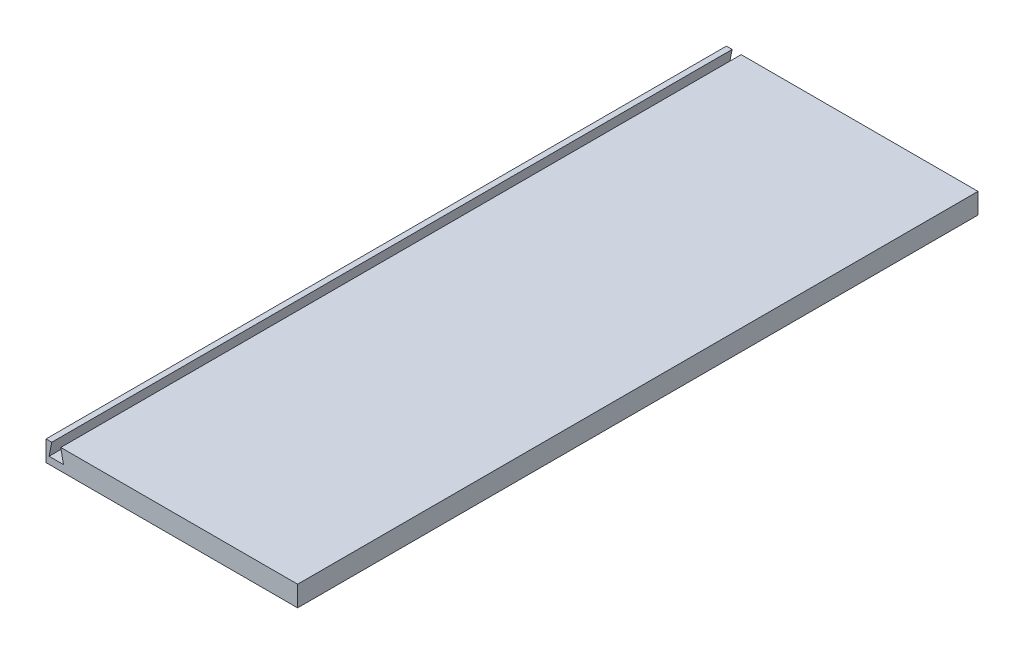
ISO-10303-21;
HEADER;
FILE_DESCRIPTION(('STEP AP214'),'2;1');
FILE_NAME('part.step','',(''),(''),'','','');
FILE_SCHEMA(('AUTOMOTIVE_DESIGN { 1 0 10303 214 1 1 1 1 }'));
ENDSEC;
DATA;
#1=APPLICATION_CONTEXT('core data for automotive mechanical design processes');
#2=APPLICATION_PROTOCOL_DEFINITION('international standard','automotive_design',2000,#1);
#3=PRODUCT_CONTEXT('',#1,'mechanical');
#4=PRODUCT('Part','Part','',(#3));
#5=PRODUCT_RELATED_PRODUCT_CATEGORY('part','',(#4));
#6=PRODUCT_DEFINITION_FORMATION('','',#4);
#7=PRODUCT_DEFINITION_CONTEXT('part definition',#1,'design');
#8=PRODUCT_DEFINITION('design','',#6,#7);
#9=PRODUCT_DEFINITION_SHAPE('','',#8);
#10=(LENGTH_UNIT() NAMED_UNIT(*) SI_UNIT(.MILLI.,.METRE.));
#11=(NAMED_UNIT(*) PLANE_ANGLE_UNIT() SI_UNIT($,.RADIAN.));
#12=(NAMED_UNIT(*) SI_UNIT($,.STERADIAN.) SOLID_ANGLE_UNIT());
#13=UNCERTAINTY_MEASURE_WITH_UNIT(LENGTH_MEASURE(1.E-05),#10,'distance_accuracy_value','');
#14=(GEOMETRIC_REPRESENTATION_CONTEXT(3) GLOBAL_UNCERTAINTY_ASSIGNED_CONTEXT((#13)) GLOBAL_UNIT_ASSIGNED_CONTEXT((#10,
#11,#12)) REPRESENTATION_CONTEXT('',''));
#15=CARTESIAN_POINT('',(0.,0.,0.));
#16=DIRECTION('',(0.,0.,1.));
#17=DIRECTION('',(1.,0.,0.));
#18=AXIS2_PLACEMENT_3D('',#15,#16,#17);
#19=CARTESIAN_POINT('',(0.,8.,-265.));
#20=DIRECTION('',(0.,1.,0.));
#21=DIRECTION('',(0.,0.,1.));
#22=AXIS2_PLACEMENT_3D('',#19,#20,#21);
#23=PLANE('',#22);
#24=DIRECTION('',(0.,0.,1.));
#25=VECTOR('',#24,1.);
#26=CARTESIAN_POINT('',(5.75495097567964,8.,-265.));
#27=LINE('',#26,#25);
#28=CARTESIAN_POINT('',(5.75495097567964,8.,-265.));
#29=VERTEX_POINT('',#28);
#30=CARTESIAN_POINT('',(5.75495097567964,8.,0.));
#31=VERTEX_POINT('',#30);
#32=EDGE_CURVE('E135',#29,#31,#27,.T.);
#33=ORIENTED_EDGE('',*,*,#32,.T.);
#34=DIRECTION('',(-1.,0.,0.));
#35=VECTOR('',#34,1.);
#36=CARTESIAN_POINT('',(0.,8.,0.));
#37=LINE('',#36,#35);
#38=CARTESIAN_POINT('',(98.,8.,0.));
#39=VERTEX_POINT('',#38);
#40=EDGE_CURVE('E141',#39,#31,#37,.T.);
#41=ORIENTED_EDGE('',*,*,#40,.F.);
#42=DIRECTION('',(0.,0.,1.));
#43=VECTOR('',#42,1.);
#44=CARTESIAN_POINT('',(98.,8.,-265.));
#45=LINE('',#44,#43);
#46=CARTESIAN_POINT('',(98.,8.,-265.));
#47=VERTEX_POINT('',#46);
#48=EDGE_CURVE('E41',#47,#39,#45,.T.);
#49=ORIENTED_EDGE('',*,*,#48,.F.);
#50=DIRECTION('',(-1.,0.,0.));
#51=VECTOR('',#50,1.);
#52=CARTESIAN_POINT('',(0.,8.,-265.));
#53=LINE('',#52,#51);
#54=EDGE_CURVE('E123',#47,#29,#53,.T.);
#55=ORIENTED_EDGE('',*,*,#54,.T.);
#56=EDGE_LOOP('',(#33,#41,#49,#55));
#57=FACE_BOUND('',#56,.T.);
#58=ADVANCED_FACE('F32',(#57),#23,.T.);
#59=CARTESIAN_POINT('',(0.,0.,-265.));
#60=DIRECTION('',(-1.,0.,0.));
#61=DIRECTION('',(0.,0.,1.));
#62=AXIS2_PLACEMENT_3D('',#59,#60,#61);
#63=PLANE('',#62);
#64=DIRECTION('',(0.,-1.,0.));
#65=VECTOR('',#64,1.);
#66=CARTESIAN_POINT('',(0.,0.,0.));
#67=LINE('',#66,#65);
#68=CARTESIAN_POINT('',(0.,8.,0.));
#69=VERTEX_POINT('',#68);
#70=CARTESIAN_POINT('',(0.,0.,0.));
#71=VERTEX_POINT('',#70);
#72=EDGE_CURVE('E132',#69,#71,#67,.T.);
#73=ORIENTED_EDGE('',*,*,#72,.F.);
#74=DIRECTION('',(0.,0.,1.));
#75=VECTOR('',#74,1.);
#76=CARTESIAN_POINT('',(0.,8.,-265.));
#77=LINE('',#76,#75);
#78=CARTESIAN_POINT('',(0.,8.,-265.));
#79=VERTEX_POINT('',#78);
#80=EDGE_CURVE('E11',#79,#69,#77,.T.);
#81=ORIENTED_EDGE('',*,*,#80,.F.);
#82=DIRECTION('',(0.,-1.,0.));
#83=VECTOR('',#82,1.);
#84=CARTESIAN_POINT('',(0.,0.,-265.));
#85=LINE('',#84,#83);
#86=CARTESIAN_POINT('',(0.,0.,-265.));
#87=VERTEX_POINT('',#86);
#88=EDGE_CURVE('E122',#79,#87,#85,.T.);
#89=ORIENTED_EDGE('',*,*,#88,.T.);
#90=DIRECTION('',(0.,0.,1.));
#91=VECTOR('',#90,1.);
#92=CARTESIAN_POINT('',(0.,0.,-265.));
#93=LINE('',#92,#91);
#94=EDGE_CURVE('E36',#87,#71,#93,.T.);
#95=ORIENTED_EDGE('',*,*,#94,.T.);
#96=EDGE_LOOP('',(#73,#81,#89,#95));
#97=FACE_BOUND('',#96,.T.);
#98=ADVANCED_FACE('F34',(#97),#63,.T.);
#99=DIRECTION('',(0.,0.,1.));
#100=VECTOR('',#99,1.);
#101=CARTESIAN_POINT('',(2.24504902432036,8.,-265.));
#102=LINE('',#101,#100);
#103=CARTESIAN_POINT('',(2.24504902432036,8.,-265.));
#104=VERTEX_POINT('',#103);
#105=CARTESIAN_POINT('',(2.24504902432036,8.,0.));
#106=VERTEX_POINT('',#105);
#107=EDGE_CURVE('E49',#104,#106,#102,.T.);
#108=ORIENTED_EDGE('',*,*,#107,.F.);
#109=EDGE_CURVE('E56',#104,#79,#53,.T.);
#110=ORIENTED_EDGE('',*,*,#109,.T.);
#111=ORIENTED_EDGE('',*,*,#80,.T.);
#112=EDGE_CURVE('E78',#106,#69,#37,.T.);
#113=ORIENTED_EDGE('',*,*,#112,.F.);
#114=EDGE_LOOP('',(#108,#110,#111,#113));
#115=FACE_BOUND('',#114,.T.);
#116=ADVANCED_FACE('F115',(#115),#23,.T.);
#117=CARTESIAN_POINT('',(98.,0.,-265.));
#118=DIRECTION('',(1.,0.,0.));
#119=DIRECTION('',(0.,0.,-1.));
#120=AXIS2_PLACEMENT_3D('',#117,#118,#119);
#121=PLANE('',#120);
#122=DIRECTION('',(0.,1.,0.));
#123=VECTOR('',#122,1.);
#124=CARTESIAN_POINT('',(98.,0.,0.));
#125=LINE('',#124,#123);
#126=CARTESIAN_POINT('',(98.,0.,0.));
#127=VERTEX_POINT('',#126);
#128=EDGE_CURVE('E138',#127,#39,#125,.T.);
#129=ORIENTED_EDGE('',*,*,#128,.F.);
#130=DIRECTION('',(0.,0.,1.));
#131=VECTOR('',#130,1.);
#132=CARTESIAN_POINT('',(98.,0.,-265.));
#133=LINE('',#132,#131);
#134=CARTESIAN_POINT('',(98.,0.,-265.));
#135=VERTEX_POINT('',#134);
#136=EDGE_CURVE('E144',#135,#127,#133,.T.);
#137=ORIENTED_EDGE('',*,*,#136,.F.);
#138=DIRECTION('',(0.,1.,0.));
#139=VECTOR('',#138,1.);
#140=CARTESIAN_POINT('',(98.,0.,-265.));
#141=LINE('',#140,#139);
#142=EDGE_CURVE('E124',#135,#47,#141,.T.);
#143=ORIENTED_EDGE('',*,*,#142,.T.);
#144=ORIENTED_EDGE('',*,*,#48,.T.);
#145=EDGE_LOOP('',(#129,#137,#143,#144));
#146=FACE_BOUND('',#145,.T.);
#147=ADVANCED_FACE('F172',(#146),#121,.T.);
#148=CARTESIAN_POINT('',(0.,0.,-265.));
#149=DIRECTION('',(0.,-1.,0.));
#150=DIRECTION('',(0.,0.,-1.));
#151=AXIS2_PLACEMENT_3D('',#148,#149,#150);
#152=PLANE('',#151);
#153=DIRECTION('',(1.,0.,0.));
#154=VECTOR('',#153,1.);
#155=CARTESIAN_POINT('',(0.,0.,0.));
#156=LINE('',#155,#154);
#157=EDGE_CURVE('E134',#71,#127,#156,.T.);
#158=ORIENTED_EDGE('',*,*,#157,.F.);
#159=ORIENTED_EDGE('',*,*,#94,.F.);
#160=DIRECTION('',(1.,0.,0.));
#161=VECTOR('',#160,1.);
#162=CARTESIAN_POINT('',(0.,0.,-265.));
#163=LINE('',#162,#161);
#164=EDGE_CURVE('E128',#87,#135,#163,.T.);
#165=ORIENTED_EDGE('',*,*,#164,.T.);
#166=ORIENTED_EDGE('',*,*,#136,.T.);
#167=EDGE_LOOP('',(#158,#159,#165,#166));
#168=FACE_BOUND('',#167,.T.);
#169=ADVANCED_FACE('F148',(#168),#152,.T.);
#170=CARTESIAN_POINT('',(0.,0.,-265.));
#171=DIRECTION('',(0.,0.,-1.));
#172=DIRECTION('',(-1.,0.,0.));
#173=AXIS2_PLACEMENT_3D('',#170,#171,#172);
#174=PLANE('',#173);
#175=DIRECTION('',(-0.196116135138184,0.98058067569092,0.));
#176=VECTOR('',#175,1.);
#177=CARTESIAN_POINT('',(6.80495097567964,2.75,-265.));
#178=LINE('',#177,#176);
#179=CARTESIAN_POINT('',(6.80495097567964,2.75,-265.));
#180=VERTEX_POINT('',#179);
#181=EDGE_CURVE('E116',#180,#29,#178,.T.);
#182=ORIENTED_EDGE('',*,*,#181,.T.);
#183=ORIENTED_EDGE('',*,*,#54,.F.);
#184=ORIENTED_EDGE('',*,*,#142,.F.);
#185=ORIENTED_EDGE('',*,*,#164,.F.);
#186=ORIENTED_EDGE('',*,*,#88,.F.);
#187=ORIENTED_EDGE('',*,*,#109,.F.);
#188=DIRECTION('',(-0.196116135138184,-0.98058067569092,0.));
#189=VECTOR('',#188,1.);
#190=CARTESIAN_POINT('',(2.24504902432036,8.,-265.));
#191=LINE('',#190,#189);
#192=CARTESIAN_POINT('',(1.19504902432036,2.75,-265.));
#193=VERTEX_POINT('',#192);
#194=EDGE_CURVE('E106',#104,#193,#191,.T.);
#195=ORIENTED_EDGE('',*,*,#194,.T.);
#196=DIRECTION('',(1.,0.,0.));
#197=VECTOR('',#196,1.);
#198=CARTESIAN_POINT('',(1.19504902432036,2.75,-265.));
#199=LINE('',#198,#197);
#200=EDGE_CURVE('E112',#193,#180,#199,.T.);
#201=ORIENTED_EDGE('',*,*,#200,.T.);
#202=EDGE_LOOP('',(#182,#183,#184,#185,#186,#187,#195,#201));
#203=FACE_BOUND('',#202,.T.);
#204=ADVANCED_FACE('F120',(#203),#174,.T.);
#205=CARTESIAN_POINT('',(0.,0.,0.));
#206=DIRECTION('',(0.,0.,-1.));
#207=DIRECTION('',(-1.,0.,0.));
#208=AXIS2_PLACEMENT_3D('',#205,#206,#207);
#209=PLANE('',#208);
#210=ORIENTED_EDGE('',*,*,#40,.T.);
#211=DIRECTION('',(-0.196116135138184,0.98058067569092,0.));
#212=VECTOR('',#211,1.);
#213=CARTESIAN_POINT('',(6.80495097567964,2.75,0.));
#214=LINE('',#213,#212);
#215=CARTESIAN_POINT('',(6.80495097567964,2.75,0.));
#216=VERTEX_POINT('',#215);
#217=EDGE_CURVE('E113',#216,#31,#214,.T.);
#218=ORIENTED_EDGE('',*,*,#217,.F.);
#219=DIRECTION('',(1.,0.,0.));
#220=VECTOR('',#219,1.);
#221=CARTESIAN_POINT('',(1.19504902432036,2.75,0.));
#222=LINE('',#221,#220);
#223=CARTESIAN_POINT('',(1.19504902432036,2.75,0.));
#224=VERTEX_POINT('',#223);
#225=EDGE_CURVE('E194',#224,#216,#222,.T.);
#226=ORIENTED_EDGE('',*,*,#225,.F.);
#227=DIRECTION('',(-0.196116135138184,-0.98058067569092,0.));
#228=VECTOR('',#227,1.);
#229=CARTESIAN_POINT('',(2.24504902432036,8.,0.));
#230=LINE('',#229,#228);
#231=EDGE_CURVE('E193',#106,#224,#230,.T.);
#232=ORIENTED_EDGE('',*,*,#231,.F.);
#233=ORIENTED_EDGE('',*,*,#112,.T.);
#234=ORIENTED_EDGE('',*,*,#72,.T.);
#235=ORIENTED_EDGE('',*,*,#157,.T.);
#236=ORIENTED_EDGE('',*,*,#128,.T.);
#237=EDGE_LOOP('',(#210,#218,#226,#232,#233,#234,#235,#236));
#238=FACE_BOUND('',#237,.T.);
#239=ADVANCED_FACE('F149',(#238),#209,.F.);
#240=CARTESIAN_POINT('',(6.80495097567964,2.75,-265.));
#241=DIRECTION('',(0.98058067569092,0.196116135138184,0.));
#242=DIRECTION('',(-0.196116135138184,0.98058067569092,0.));
#243=AXIS2_PLACEMENT_3D('',#240,#241,#242);
#244=PLANE('',#243);
#245=ORIENTED_EDGE('',*,*,#217,.T.);
#246=ORIENTED_EDGE('',*,*,#32,.F.);
#247=ORIENTED_EDGE('',*,*,#181,.F.);
#248=DIRECTION('',(0.,0.,1.));
#249=VECTOR('',#248,1.);
#250=CARTESIAN_POINT('',(6.80495097567964,2.75,-265.));
#251=LINE('',#250,#249);
#252=EDGE_CURVE('E183',#180,#216,#251,.T.);
#253=ORIENTED_EDGE('',*,*,#252,.T.);
#254=EDGE_LOOP('',(#245,#246,#247,#253));
#255=FACE_BOUND('',#254,.T.);
#256=ADVANCED_FACE('F153',(#255),#244,.F.);
#257=CARTESIAN_POINT('',(1.19504902432036,2.75,-265.));
#258=DIRECTION('',(0.,-1.,0.));
#259=DIRECTION('',(0.,0.,-1.));
#260=AXIS2_PLACEMENT_3D('',#257,#258,#259);
#261=PLANE('',#260);
#262=ORIENTED_EDGE('',*,*,#225,.T.);
#263=ORIENTED_EDGE('',*,*,#252,.F.);
#264=ORIENTED_EDGE('',*,*,#200,.F.);
#265=DIRECTION('',(0.,0.,1.));
#266=VECTOR('',#265,1.);
#267=CARTESIAN_POINT('',(1.19504902432036,2.75,-265.));
#268=LINE('',#267,#266);
#269=EDGE_CURVE('E108',#193,#224,#268,.T.);
#270=ORIENTED_EDGE('',*,*,#269,.T.);
#271=EDGE_LOOP('',(#262,#263,#264,#270));
#272=FACE_BOUND('',#271,.T.);
#273=ADVANCED_FACE('F159',(#272),#261,.F.);
#274=CARTESIAN_POINT('',(2.24504902432036,8.,-265.));
#275=DIRECTION('',(-0.98058067569092,0.196116135138184,0.));
#276=DIRECTION('',(-0.196116135138184,-0.98058067569092,0.));
#277=AXIS2_PLACEMENT_3D('',#274,#275,#276);
#278=PLANE('',#277);
#279=ORIENTED_EDGE('',*,*,#231,.T.);
#280=ORIENTED_EDGE('',*,*,#269,.F.);
#281=ORIENTED_EDGE('',*,*,#194,.F.);
#282=ORIENTED_EDGE('',*,*,#107,.T.);
#283=EDGE_LOOP('',(#279,#280,#281,#282));
#284=FACE_BOUND('',#283,.T.);
#285=ADVANCED_FACE('F107',(#284),#278,.F.);
#286=CLOSED_SHELL('',(#58,#98,#116,#147,#169,#204,#239,#256,#273,#285));
#287=MANIFOLD_SOLID_BREP('B2',#286);
#288=ADVANCED_BREP_SHAPE_REPRESENTATION('',(#18,#287),#14);
#289=SHAPE_DEFINITION_REPRESENTATION(#9,#288);
ENDSEC;
END-ISO-10303-21;
